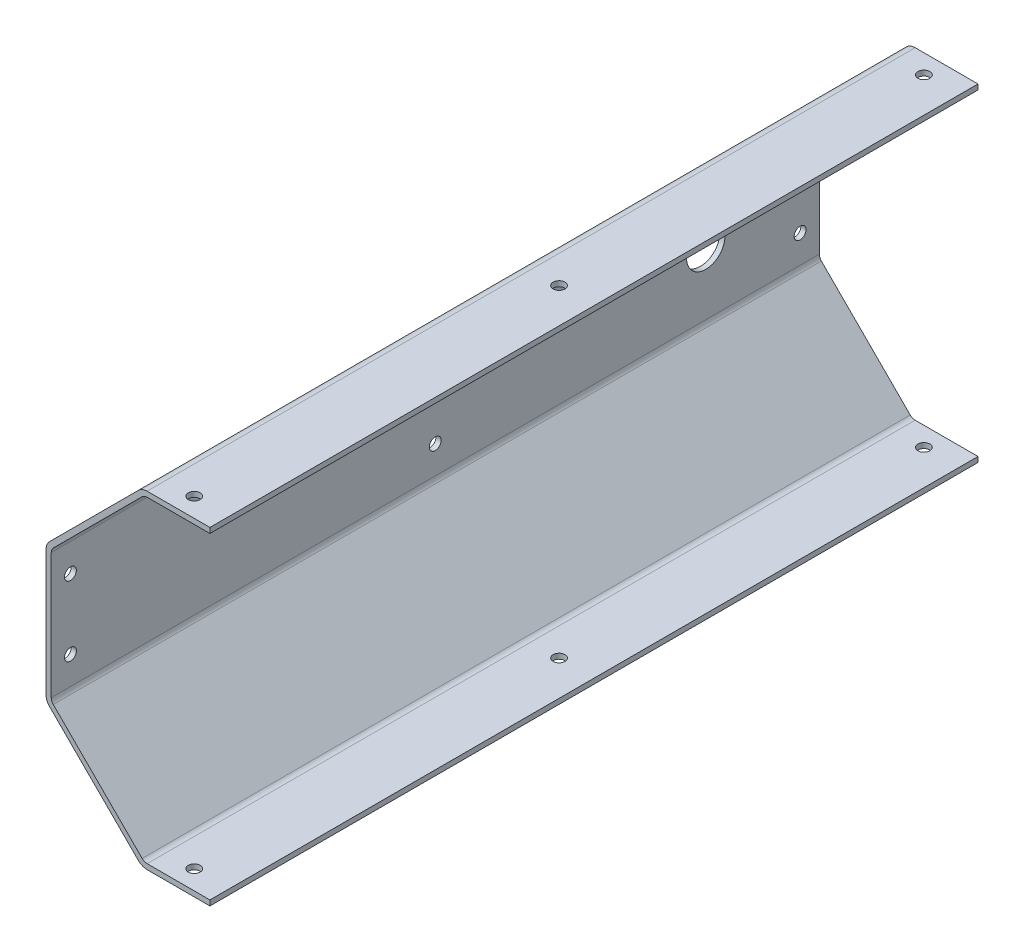
ISO-10303-21;
HEADER;
FILE_DESCRIPTION(('STEP AP214'),'2;1');
FILE_NAME('part.step','',(''),(''),'','','');
FILE_SCHEMA(('AUTOMOTIVE_DESIGN { 1 0 10303 214 1 1 1 1 }'));
ENDSEC;
DATA;
#1=APPLICATION_CONTEXT('core data for automotive mechanical design processes');
#2=APPLICATION_PROTOCOL_DEFINITION('international standard','automotive_design',2000,#1);
#3=PRODUCT_CONTEXT('',#1,'mechanical');
#4=PRODUCT('Part','Part','',(#3));
#5=PRODUCT_RELATED_PRODUCT_CATEGORY('part','',(#4));
#6=PRODUCT_DEFINITION_FORMATION('','',#4);
#7=PRODUCT_DEFINITION_CONTEXT('part definition',#1,'design');
#8=PRODUCT_DEFINITION('design','',#6,#7);
#9=PRODUCT_DEFINITION_SHAPE('','',#8);
#10=(LENGTH_UNIT() NAMED_UNIT(*) SI_UNIT(.MILLI.,.METRE.));
#11=(NAMED_UNIT(*) PLANE_ANGLE_UNIT() SI_UNIT($,.RADIAN.));
#12=(NAMED_UNIT(*) SI_UNIT($,.STERADIAN.) SOLID_ANGLE_UNIT());
#13=UNCERTAINTY_MEASURE_WITH_UNIT(LENGTH_MEASURE(1.E-05),#10,'distance_accuracy_value','');
#14=(GEOMETRIC_REPRESENTATION_CONTEXT(3) GLOBAL_UNCERTAINTY_ASSIGNED_CONTEXT((#13)) GLOBAL_UNIT_ASSIGNED_CONTEXT((#10,
#11,#12)) REPRESENTATION_CONTEXT('',''));
#15=CARTESIAN_POINT('',(0.,0.,0.));
#16=DIRECTION('',(0.,0.,1.));
#17=DIRECTION('',(1.,0.,0.));
#18=AXIS2_PLACEMENT_3D('',#15,#16,#17);
#19=CARTESIAN_POINT('',(-96.95,-17.9975792851109,-168.5));
#20=DIRECTION('',(1.,0.,0.));
#21=DIRECTION('',(0.,1.,0.));
#22=AXIS2_PLACEMENT_3D('',#19,#20,#21);
#23=PLANE('',#22);
#24=DIRECTION('',(0.,1.,0.));
#25=VECTOR('',#24,1.);
#26=CARTESIAN_POINT('',(-96.95,-17.9975792851109,51.5));
#27=LINE('',#26,#25);
#28=CARTESIAN_POINT('',(-96.95,-17.9975792851109,51.5));
#29=VERTEX_POINT('',#28);
#30=CARTESIAN_POINT('',(-96.95,17.9975792851113,51.5));
#31=VERTEX_POINT('',#30);
#32=EDGE_CURVE('E127',#29,#31,#27,.T.);
#33=ORIENTED_EDGE('',*,*,#32,.T.);
#34=DIRECTION('',(0.,0.,1.));
#35=VECTOR('',#34,1.);
#36=CARTESIAN_POINT('',(-96.95,17.9975792851113,-168.5));
#37=LINE('',#36,#35);
#38=CARTESIAN_POINT('',(-96.95,17.9975792851113,-168.5));
#39=VERTEX_POINT('',#38);
#40=EDGE_CURVE('E249',#39,#31,#37,.T.);
#41=ORIENTED_EDGE('',*,*,#40,.F.);
#42=DIRECTION('',(0.,1.,0.));
#43=VECTOR('',#42,1.);
#44=CARTESIAN_POINT('',(-96.95,-17.9975792851109,-168.5));
#45=LINE('',#44,#43);
#46=CARTESIAN_POINT('',(-96.95,-17.9975792851109,-168.5));
#47=VERTEX_POINT('',#46);
#48=EDGE_CURVE('E56',#47,#39,#45,.T.);
#49=ORIENTED_EDGE('',*,*,#48,.F.);
#50=DIRECTION('',(0.,0.,1.));
#51=VECTOR('',#50,1.);
#52=CARTESIAN_POINT('',(-96.95,-17.9975792851109,-168.5));
#53=LINE('',#52,#51);
#54=EDGE_CURVE('E200',#47,#29,#53,.T.);
#55=ORIENTED_EDGE('',*,*,#54,.T.);
#56=EDGE_LOOP('',(#33,#41,#49,#55));
#57=FACE_BOUND('',#56,.T.);
#58=CARTESIAN_POINT('',(-96.95,10.,-163.));
#59=DIRECTION('',(1.,0.,0.));
#60=DIRECTION('',(0.,1.,0.));
#61=AXIS2_PLACEMENT_3D('',#58,#59,#60);
#62=CIRCLE('',#61,1.7);
#63=CARTESIAN_POINT('',(-96.95,11.7,-163.));
#64=VERTEX_POINT('',#63);
#65=EDGE_CURVE('E868',#64,#64,#62,.T.);
#66=ORIENTED_EDGE('',*,*,#65,.T.);
#67=EDGE_LOOP('',(#66));
#68=FACE_BOUND('',#67,.T.);
#69=CARTESIAN_POINT('',(-96.95,-10.,-163.));
#70=DIRECTION('',(1.,0.,0.));
#71=DIRECTION('',(0.,1.,0.));
#72=AXIS2_PLACEMENT_3D('',#69,#70,#71);
#73=CIRCLE('',#72,1.7);
#74=CARTESIAN_POINT('',(-96.95,-8.3,-163.));
#75=VERTEX_POINT('',#74);
#76=EDGE_CURVE('E876',#75,#75,#73,.T.);
#77=ORIENTED_EDGE('',*,*,#76,.T.);
#78=EDGE_LOOP('',(#77));
#79=FACE_BOUND('',#78,.T.);
#80=CARTESIAN_POINT('',(-96.95,10.,-58.5));
#81=DIRECTION('',(1.,0.,0.));
#82=DIRECTION('',(0.,1.,0.));
#83=AXIS2_PLACEMENT_3D('',#80,#81,#82);
#84=CIRCLE('',#83,1.7);
#85=CARTESIAN_POINT('',(-96.95,11.7,-58.5));
#86=VERTEX_POINT('',#85);
#87=EDGE_CURVE('E882',#86,#86,#84,.T.);
#88=ORIENTED_EDGE('',*,*,#87,.T.);
#89=EDGE_LOOP('',(#88));
#90=FACE_BOUND('',#89,.T.);
#91=CARTESIAN_POINT('',(-96.95,-10.,-58.5));
#92=DIRECTION('',(1.,0.,0.));
#93=DIRECTION('',(0.,1.,0.));
#94=AXIS2_PLACEMENT_3D('',#91,#92,#93);
#95=CIRCLE('',#94,1.7);
#96=CARTESIAN_POINT('',(-96.95,-8.3,-58.5));
#97=VERTEX_POINT('',#96);
#98=EDGE_CURVE('E888',#97,#97,#95,.T.);
#99=ORIENTED_EDGE('',*,*,#98,.T.);
#100=EDGE_LOOP('',(#99));
#101=FACE_BOUND('',#100,.T.);
#102=CARTESIAN_POINT('',(-96.95,-10.,46.));
#103=DIRECTION('',(1.,0.,0.));
#104=DIRECTION('',(0.,1.,0.));
#105=AXIS2_PLACEMENT_3D('',#102,#103,#104);
#106=CIRCLE('',#105,1.7);
#107=CARTESIAN_POINT('',(-96.95,-8.3,46.));
#108=VERTEX_POINT('',#107);
#109=EDGE_CURVE('E894',#108,#108,#106,.T.);
#110=ORIENTED_EDGE('',*,*,#109,.T.);
#111=EDGE_LOOP('',(#110));
#112=FACE_BOUND('',#111,.T.);
#113=CARTESIAN_POINT('',(-96.95,10.,46.));
#114=DIRECTION('',(1.,0.,0.));
#115=DIRECTION('',(0.,1.,0.));
#116=AXIS2_PLACEMENT_3D('',#113,#114,#115);
#117=CIRCLE('',#116,1.7);
#118=CARTESIAN_POINT('',(-96.95,11.7,46.));
#119=VERTEX_POINT('',#118);
#120=EDGE_CURVE('E900',#119,#119,#117,.T.);
#121=ORIENTED_EDGE('',*,*,#120,.T.);
#122=EDGE_LOOP('',(#121));
#123=FACE_BOUND('',#122,.T.);
#124=CARTESIAN_POINT('',(-96.95,4.6743024256779E-05,-135.980047718646));
#125=DIRECTION('',(-1.,0.,0.));
#126=DIRECTION('',(0.,0.,1.));
#127=AXIS2_PLACEMENT_3D('',#124,#125,#126);
#128=CIRCLE('',#127,5.5);
#129=CARTESIAN_POINT('',(-96.95,4.67430242564422E-05,-130.480047718646));
#130=VERTEX_POINT('',#129);
#131=EDGE_CURVE('E903',#130,#130,#128,.T.);
#132=ORIENTED_EDGE('',*,*,#131,.F.);
#133=EDGE_LOOP('',(#132));
#134=FACE_BOUND('',#133,.T.);
#135=ADVANCED_FACE('F37',(#57,#68,#79,#90,#101,#112,#123,#134),#23,.F.);
#136=CARTESIAN_POINT('',(-50.,45.45,-168.5));
#137=DIRECTION('',(0.,1.,0.));
#138=DIRECTION('',(-1.,0.,0.));
#139=AXIS2_PLACEMENT_3D('',#136,#137,#138);
#140=PLANE('',#139);
#141=DIRECTION('',(-1.,0.,0.));
#142=VECTOR('',#141,1.);
#143=CARTESIAN_POINT('',(-50.,45.45,51.5));
#144=LINE('',#143,#142);
#145=CARTESIAN_POINT('',(-50.,45.45,51.5));
#146=VERTEX_POINT('',#145);
#147=CARTESIAN_POINT('',(-67.9975792851107,45.45,51.5));
#148=VERTEX_POINT('',#147);
#149=EDGE_CURVE('E219',#146,#148,#144,.T.);
#150=ORIENTED_EDGE('',*,*,#149,.T.);
#151=DIRECTION('',(0.,0.,1.));
#152=VECTOR('',#151,1.);
#153=CARTESIAN_POINT('',(-67.9975792851107,45.45,-168.5));
#154=LINE('',#153,#152);
#155=CARTESIAN_POINT('',(-67.9975792851107,45.45,-168.5));
#156=VERTEX_POINT('',#155);
#157=EDGE_CURVE('E283',#156,#148,#154,.T.);
#158=ORIENTED_EDGE('',*,*,#157,.F.);
#159=DIRECTION('',(-1.,0.,0.));
#160=VECTOR('',#159,1.);
#161=CARTESIAN_POINT('',(-50.,45.45,-168.5));
#162=LINE('',#161,#160);
#163=CARTESIAN_POINT('',(-50.,45.45,-168.5));
#164=VERTEX_POINT('',#163);
#165=EDGE_CURVE('E318',#164,#156,#162,.T.);
#166=ORIENTED_EDGE('',*,*,#165,.F.);
#167=DIRECTION('',(0.,0.,1.));
#168=VECTOR('',#167,1.);
#169=CARTESIAN_POINT('',(-50.,45.45,-168.5));
#170=LINE('',#169,#168);
#171=EDGE_CURVE('E286',#164,#146,#170,.T.);
#172=ORIENTED_EDGE('',*,*,#171,.T.);
#173=EDGE_LOOP('',(#150,#158,#166,#172));
#174=FACE_BOUND('',#173,.T.);
#175=CARTESIAN_POINT('',(-59.9999999999969,45.45,-163.));
#176=DIRECTION('',(0.,1.,0.));
#177=DIRECTION('',(0.,0.,-1.));
#178=AXIS2_PLACEMENT_3D('',#175,#176,#177);
#179=CIRCLE('',#178,1.7);
#180=CARTESIAN_POINT('',(-59.9999999999969,45.45,-164.7));
#181=VERTEX_POINT('',#180);
#182=EDGE_CURVE('E424',#181,#181,#179,.T.);
#183=ORIENTED_EDGE('',*,*,#182,.T.);
#184=EDGE_LOOP('',(#183));
#185=FACE_BOUND('',#184,.T.);
#186=CARTESIAN_POINT('',(-59.9999999999969,45.45,-58.5));
#187=DIRECTION('',(0.,1.,0.));
#188=DIRECTION('',(0.,0.,-1.));
#189=AXIS2_PLACEMENT_3D('',#186,#187,#188);
#190=CIRCLE('',#189,1.7);
#191=CARTESIAN_POINT('',(-59.9999999999969,45.45,-60.2));
#192=VERTEX_POINT('',#191);
#193=EDGE_CURVE('E413',#192,#192,#190,.T.);
#194=ORIENTED_EDGE('',*,*,#193,.T.);
#195=EDGE_LOOP('',(#194));
#196=FACE_BOUND('',#195,.T.);
#197=CARTESIAN_POINT('',(-59.9999999999969,45.45,46.));
#198=DIRECTION('',(0.,-1.,0.));
#199=DIRECTION('',(0.,0.,-1.));
#200=AXIS2_PLACEMENT_3D('',#197,#198,#199);
#201=CIRCLE('',#200,1.7);
#202=CARTESIAN_POINT('',(-59.9999999999969,45.45,44.3));
#203=VERTEX_POINT('',#202);
#204=EDGE_CURVE('E414',#203,#203,#201,.T.);
#205=ORIENTED_EDGE('',*,*,#204,.F.);
#206=EDGE_LOOP('',(#205));
#207=FACE_BOUND('',#206,.T.);
#208=ADVANCED_FACE('F395',(#174,#185,#196,#207),#140,.F.);
#209=CARTESIAN_POINT('',(-67.9975792851107,46.95,-168.5));
#210=DIRECTION('',(0.,-1.,0.));
#211=DIRECTION('',(1.,0.,0.));
#212=AXIS2_PLACEMENT_3D('',#209,#210,#211);
#213=PLANE('',#212);
#214=CARTESIAN_POINT('',(-59.9999999999969,46.95,46.));
#215=DIRECTION('',(0.,-1.,0.));
#216=DIRECTION('',(0.,0.,-1.));
#217=AXIS2_PLACEMENT_3D('',#214,#215,#216);
#218=CIRCLE('',#217,1.7);
#219=CARTESIAN_POINT('',(-59.9999999999969,46.95,44.3));
#220=VERTEX_POINT('',#219);
#221=EDGE_CURVE('E420',#220,#220,#218,.T.);
#222=ORIENTED_EDGE('',*,*,#221,.T.);
#223=EDGE_LOOP('',(#222));
#224=FACE_BOUND('',#223,.T.);
#225=CARTESIAN_POINT('',(-59.9999999999969,46.95,-163.));
#226=DIRECTION('',(0.,1.,0.));
#227=DIRECTION('',(0.,0.,-1.));
#228=AXIS2_PLACEMENT_3D('',#225,#226,#227);
#229=CIRCLE('',#228,1.7);
#230=CARTESIAN_POINT('',(-59.9999999999969,46.95,-164.7));
#231=VERTEX_POINT('',#230);
#232=EDGE_CURVE('E417',#231,#231,#229,.T.);
#233=ORIENTED_EDGE('',*,*,#232,.F.);
#234=EDGE_LOOP('',(#233));
#235=FACE_BOUND('',#234,.T.);
#236=DIRECTION('',(1.,0.,0.));
#237=VECTOR('',#236,1.);
#238=CARTESIAN_POINT('',(-67.9975792851107,46.95,51.5));
#239=LINE('',#238,#237);
#240=CARTESIAN_POINT('',(-67.9975792851107,46.95,51.5));
#241=VERTEX_POINT('',#240);
#242=CARTESIAN_POINT('',(-50.,46.95,51.5));
#243=VERTEX_POINT('',#242);
#244=EDGE_CURVE('E215',#241,#243,#239,.T.);
#245=ORIENTED_EDGE('',*,*,#244,.T.);
#246=DIRECTION('',(0.,0.,1.));
#247=VECTOR('',#246,1.);
#248=CARTESIAN_POINT('',(-50.,46.95,-168.5));
#249=LINE('',#248,#247);
#250=CARTESIAN_POINT('',(-50.,46.95,-168.5));
#251=VERTEX_POINT('',#250);
#252=EDGE_CURVE('E289',#251,#243,#249,.T.);
#253=ORIENTED_EDGE('',*,*,#252,.F.);
#254=DIRECTION('',(1.,0.,0.));
#255=VECTOR('',#254,1.);
#256=CARTESIAN_POINT('',(-67.9975792851107,46.95,-168.5));
#257=LINE('',#256,#255);
#258=CARTESIAN_POINT('',(-67.9975792851107,46.95,-168.5));
#259=VERTEX_POINT('',#258);
#260=EDGE_CURVE('E309',#259,#251,#257,.T.);
#261=ORIENTED_EDGE('',*,*,#260,.F.);
#262=DIRECTION('',(0.,0.,1.));
#263=VECTOR('',#262,1.);
#264=CARTESIAN_POINT('',(-67.9975792851107,46.95,-168.5));
#265=LINE('',#264,#263);
#266=EDGE_CURVE('E47',#259,#241,#265,.T.);
#267=ORIENTED_EDGE('',*,*,#266,.T.);
#268=EDGE_LOOP('',(#245,#253,#261,#267));
#269=FACE_BOUND('',#268,.T.);
#270=CARTESIAN_POINT('',(-59.9999999999969,46.95,-58.5));
#271=DIRECTION('',(0.,1.,0.));
#272=DIRECTION('',(0.,0.,-1.));
#273=AXIS2_PLACEMENT_3D('',#270,#271,#272);
#274=CIRCLE('',#273,1.7);
#275=CARTESIAN_POINT('',(-59.9999999999969,46.95,-60.2));
#276=VERTEX_POINT('',#275);
#277=EDGE_CURVE('E411',#276,#276,#274,.T.);
#278=ORIENTED_EDGE('',*,*,#277,.F.);
#279=EDGE_LOOP('',(#278));
#280=FACE_BOUND('',#279,.T.);
#281=ADVANCED_FACE('F404',(#224,#235,#269,#280),#213,.F.);
#282=CARTESIAN_POINT('',(-95.9248737341529,20.4724530192641,-168.5));
#283=DIRECTION('',(0.707106781186543,-0.707106781186553,0.));
#284=DIRECTION('',(0.707106781186553,0.707106781186543,0.));
#285=AXIS2_PLACEMENT_3D('',#282,#283,#284);
#286=PLANE('',#285);
#287=DIRECTION('',(0.707106781186553,0.707106781186543,0.));
#288=VECTOR('',#287,1.);
#289=CARTESIAN_POINT('',(-95.9248737341529,20.4724530192641,51.5));
#290=LINE('',#289,#288);
#291=CARTESIAN_POINT('',(-95.9248737341529,20.4724530192641,51.5));
#292=VERTEX_POINT('',#291);
#293=CARTESIAN_POINT('',(-70.4724530192636,45.9248737341531,51.5));
#294=VERTEX_POINT('',#293);
#295=EDGE_CURVE('E209',#292,#294,#290,.T.);
#296=ORIENTED_EDGE('',*,*,#295,.T.);
#297=DIRECTION('',(0.,0.,1.));
#298=VECTOR('',#297,1.);
#299=CARTESIAN_POINT('',(-70.4724530192636,45.9248737341531,-168.5));
#300=LINE('',#299,#298);
#301=CARTESIAN_POINT('',(-70.4724530192636,45.9248737341531,-168.5));
#302=VERTEX_POINT('',#301);
#303=EDGE_CURVE('E11',#302,#294,#300,.T.);
#304=ORIENTED_EDGE('',*,*,#303,.F.);
#305=DIRECTION('',(0.707106781186553,0.707106781186543,0.));
#306=VECTOR('',#305,1.);
#307=CARTESIAN_POINT('',(-95.9248737341529,20.4724530192641,-168.5));
#308=LINE('',#307,#306);
#309=CARTESIAN_POINT('',(-95.9248737341529,20.4724530192641,-168.5));
#310=VERTEX_POINT('',#309);
#311=EDGE_CURVE('E248',#310,#302,#308,.T.);
#312=ORIENTED_EDGE('',*,*,#311,.F.);
#313=DIRECTION('',(0.,0.,1.));
#314=VECTOR('',#313,1.);
#315=CARTESIAN_POINT('',(-95.9248737341529,20.4724530192641,-168.5));
#316=LINE('',#315,#314);
#317=EDGE_CURVE('E208',#310,#292,#316,.T.);
#318=ORIENTED_EDGE('',*,*,#317,.T.);
#319=EDGE_LOOP('',(#296,#304,#312,#318));
#320=FACE_BOUND('',#319,.T.);
#321=ADVANCED_FACE('F39',(#320),#286,.F.);
#322=CARTESIAN_POINT('',(-67.9975792851107,43.45,-168.5));
#323=DIRECTION('',(0.,0.,1.));
#324=DIRECTION('',(1.,0.,0.));
#325=AXIS2_PLACEMENT_3D('',#322,#323,#324);
#326=CYLINDRICAL_SURFACE('',#325,3.5);
#327=CARTESIAN_POINT('',(-67.9975792851107,43.45,51.5));
#328=DIRECTION('',(0.,0.,-1.));
#329=DIRECTION('',(1.,0.,0.));
#330=AXIS2_PLACEMENT_3D('',#327,#328,#329);
#331=CIRCLE('',#330,3.5);
#332=EDGE_CURVE('E212',#294,#241,#331,.T.);
#333=ORIENTED_EDGE('',*,*,#332,.T.);
#334=ORIENTED_EDGE('',*,*,#266,.F.);
#335=CARTESIAN_POINT('',(-67.9975792851107,43.45,-168.5));
#336=DIRECTION('',(0.,0.,-1.));
#337=DIRECTION('',(1.,0.,0.));
#338=AXIS2_PLACEMENT_3D('',#335,#336,#337);
#339=CIRCLE('',#338,3.5);
#340=EDGE_CURVE('E307',#302,#259,#339,.T.);
#341=ORIENTED_EDGE('',*,*,#340,.F.);
#342=ORIENTED_EDGE('',*,*,#303,.T.);
#343=EDGE_LOOP('',(#333,#334,#341,#342));
#344=FACE_BOUND('',#343,.T.);
#345=ADVANCED_FACE('F306',(#344),#326,.T.);
#346=CARTESIAN_POINT('',(-50.,46.95,-168.5));
#347=DIRECTION('',(-1.,0.,0.));
#348=DIRECTION('',(0.,0.,1.));
#349=AXIS2_PLACEMENT_3D('',#346,#347,#348);
#350=PLANE('',#349);
#351=DIRECTION('',(0.,-1.,0.));
#352=VECTOR('',#351,1.);
#353=CARTESIAN_POINT('',(-50.,46.95,51.5));
#354=LINE('',#353,#352);
#355=EDGE_CURVE('E217',#243,#146,#354,.T.);
#356=ORIENTED_EDGE('',*,*,#355,.T.);
#357=ORIENTED_EDGE('',*,*,#171,.F.);
#358=DIRECTION('',(0.,-1.,0.));
#359=VECTOR('',#358,1.);
#360=CARTESIAN_POINT('',(-50.,46.95,-168.5));
#361=LINE('',#360,#359);
#362=EDGE_CURVE('E316',#251,#164,#361,.T.);
#363=ORIENTED_EDGE('',*,*,#362,.F.);
#364=ORIENTED_EDGE('',*,*,#252,.T.);
#365=EDGE_LOOP('',(#356,#357,#363,#364));
#366=FACE_BOUND('',#365,.T.);
#367=ADVANCED_FACE('F401',(#366),#350,.F.);
#368=CARTESIAN_POINT('',(-67.9975792851107,43.45,-168.5));
#369=DIRECTION('',(0.,0.,1.));
#370=DIRECTION('',(1.,0.,0.));
#371=AXIS2_PLACEMENT_3D('',#368,#369,#370);
#372=CYLINDRICAL_SURFACE('',#371,2.);
#373=CARTESIAN_POINT('',(-67.9975792851107,43.45,51.5));
#374=DIRECTION('',(0.,0.,1.));
#375=DIRECTION('',(1.,0.,0.));
#376=AXIS2_PLACEMENT_3D('',#373,#374,#375);
#377=CIRCLE('',#376,2.);
#378=CARTESIAN_POINT('',(-69.4117928474838,44.8642135623733,51.5));
#379=VERTEX_POINT('',#378);
#380=EDGE_CURVE('E221',#148,#379,#377,.T.);
#381=ORIENTED_EDGE('',*,*,#380,.T.);
#382=DIRECTION('',(0.,0.,1.));
#383=VECTOR('',#382,1.);
#384=CARTESIAN_POINT('',(-69.4117928474838,44.8642135623733,-168.5));
#385=LINE('',#384,#383);
#386=CARTESIAN_POINT('',(-69.4117928474838,44.8642135623733,-168.5));
#387=VERTEX_POINT('',#386);
#388=EDGE_CURVE('E280',#387,#379,#385,.T.);
#389=ORIENTED_EDGE('',*,*,#388,.F.);
#390=CARTESIAN_POINT('',(-67.9975792851107,43.45,-168.5));
#391=DIRECTION('',(0.,0.,1.));
#392=DIRECTION('',(1.,0.,0.));
#393=AXIS2_PLACEMENT_3D('',#390,#391,#392);
#394=CIRCLE('',#393,2.);
#395=EDGE_CURVE('E320',#156,#387,#394,.T.);
#396=ORIENTED_EDGE('',*,*,#395,.F.);
#397=ORIENTED_EDGE('',*,*,#157,.T.);
#398=EDGE_LOOP('',(#381,#389,#396,#397));
#399=FACE_BOUND('',#398,.T.);
#400=ADVANCED_FACE('F391',(#399),#372,.F.);
#401=CARTESIAN_POINT('',(-69.4117928474838,44.8642135623733,-168.5));
#402=DIRECTION('',(-0.707106781186543,0.707106781186553,0.));
#403=DIRECTION('',(-0.707106781186553,-0.707106781186543,0.));
#404=AXIS2_PLACEMENT_3D('',#401,#402,#403);
#405=PLANE('',#404);
#406=DIRECTION('',(-0.707106781186553,-0.707106781186543,0.));
#407=VECTOR('',#406,1.);
#408=CARTESIAN_POINT('',(-69.4117928474838,44.8642135623733,51.5));
#409=LINE('',#408,#407);
#410=CARTESIAN_POINT('',(-94.864213562373,19.4117928474843,51.5));
#411=VERTEX_POINT('',#410);
#412=EDGE_CURVE('E223',#379,#411,#409,.T.);
#413=ORIENTED_EDGE('',*,*,#412,.T.);
#414=DIRECTION('',(0.,0.,1.));
#415=VECTOR('',#414,1.);
#416=CARTESIAN_POINT('',(-94.864213562373,19.4117928474843,-168.5));
#417=LINE('',#416,#415);
#418=CARTESIAN_POINT('',(-94.864213562373,19.4117928474843,-168.5));
#419=VERTEX_POINT('',#418);
#420=EDGE_CURVE('E277',#419,#411,#417,.T.);
#421=ORIENTED_EDGE('',*,*,#420,.F.);
#422=DIRECTION('',(-0.707106781186553,-0.707106781186543,0.));
#423=VECTOR('',#422,1.);
#424=CARTESIAN_POINT('',(-69.4117928474838,44.8642135623733,-168.5));
#425=LINE('',#424,#423);
#426=EDGE_CURVE('E322',#387,#419,#425,.T.);
#427=ORIENTED_EDGE('',*,*,#426,.F.);
#428=ORIENTED_EDGE('',*,*,#388,.T.);
#429=EDGE_LOOP('',(#413,#421,#427,#428));
#430=FACE_BOUND('',#429,.T.);
#431=ADVANCED_FACE('F387',(#430),#405,.F.);
#432=CARTESIAN_POINT('',(-93.45,17.9975792851112,-168.5));
#433=DIRECTION('',(0.,0.,1.));
#434=DIRECTION('',(1.,0.,0.));
#435=AXIS2_PLACEMENT_3D('',#432,#433,#434);
#436=CYLINDRICAL_SURFACE('',#435,2.);
#437=CARTESIAN_POINT('',(-93.45,17.9975792851112,51.5));
#438=DIRECTION('',(0.,0.,1.));
#439=DIRECTION('',(1.,0.,0.));
#440=AXIS2_PLACEMENT_3D('',#437,#438,#439);
#441=CIRCLE('',#440,2.);
#442=CARTESIAN_POINT('',(-95.45,17.9975792851113,51.5));
#443=VERTEX_POINT('',#442);
#444=EDGE_CURVE('E225',#411,#443,#441,.T.);
#445=ORIENTED_EDGE('',*,*,#444,.T.);
#446=DIRECTION('',(0.,0.,1.));
#447=VECTOR('',#446,1.);
#448=CARTESIAN_POINT('',(-95.45,17.9975792851113,-168.5));
#449=LINE('',#448,#447);
#450=CARTESIAN_POINT('',(-95.45,17.9975792851113,-168.5));
#451=VERTEX_POINT('',#450);
#452=EDGE_CURVE('E274',#451,#443,#449,.T.);
#453=ORIENTED_EDGE('',*,*,#452,.F.);
#454=CARTESIAN_POINT('',(-93.45,17.9975792851112,-168.5));
#455=DIRECTION('',(0.,0.,1.));
#456=DIRECTION('',(1.,0.,0.));
#457=AXIS2_PLACEMENT_3D('',#454,#455,#456);
#458=CIRCLE('',#457,2.);
#459=EDGE_CURVE('E324',#419,#451,#458,.T.);
#460=ORIENTED_EDGE('',*,*,#459,.F.);
#461=ORIENTED_EDGE('',*,*,#420,.T.);
#462=EDGE_LOOP('',(#445,#453,#460,#461));
#463=FACE_BOUND('',#462,.T.);
#464=ADVANCED_FACE('F382',(#463),#436,.F.);
#465=CARTESIAN_POINT('',(-95.45,17.9975792851112,-168.5));
#466=DIRECTION('',(-1.,0.,0.));
#467=DIRECTION('',(0.,-1.,0.));
#468=AXIS2_PLACEMENT_3D('',#465,#466,#467);
#469=PLANE('',#468);
#470=CARTESIAN_POINT('',(-95.45,4.67430242533091E-05,-135.980047718646));
#471=DIRECTION('',(-1.,0.,0.));
#472=DIRECTION('',(0.,-1.,0.));
#473=AXIS2_PLACEMENT_3D('',#470,#471,#472);
#474=CIRCLE('',#473,5.5);
#475=CARTESIAN_POINT('',(-95.45,-5.49995325697575,-135.980047718646));
#476=VERTEX_POINT('',#475);
#477=EDGE_CURVE('E41',#476,#476,#474,.T.);
#478=ORIENTED_EDGE('',*,*,#477,.T.);
#479=EDGE_LOOP('',(#478));
#480=FACE_BOUND('',#479,.T.);
#481=CARTESIAN_POINT('',(-95.45,10.,46.));
#482=DIRECTION('',(-1.,0.,0.));
#483=DIRECTION('',(0.,-1.,0.));
#484=AXIS2_PLACEMENT_3D('',#481,#482,#483);
#485=CIRCLE('',#484,1.7);
#486=CARTESIAN_POINT('',(-95.45,8.3,46.));
#487=VERTEX_POINT('',#486);
#488=EDGE_CURVE('E897',#487,#487,#485,.T.);
#489=ORIENTED_EDGE('',*,*,#488,.T.);
#490=EDGE_LOOP('',(#489));
#491=FACE_BOUND('',#490,.T.);
#492=CARTESIAN_POINT('',(-95.45,-10.,46.));
#493=DIRECTION('',(-1.,0.,0.));
#494=DIRECTION('',(0.,-1.,0.));
#495=AXIS2_PLACEMENT_3D('',#492,#493,#494);
#496=CIRCLE('',#495,1.7);
#497=CARTESIAN_POINT('',(-95.45,-11.7,46.));
#498=VERTEX_POINT('',#497);
#499=EDGE_CURVE('E891',#498,#498,#496,.T.);
#500=ORIENTED_EDGE('',*,*,#499,.T.);
#501=EDGE_LOOP('',(#500));
#502=FACE_BOUND('',#501,.T.);
#503=CARTESIAN_POINT('',(-95.45,-10.,-58.5));
#504=DIRECTION('',(-1.,0.,0.));
#505=DIRECTION('',(0.,-1.,0.));
#506=AXIS2_PLACEMENT_3D('',#503,#504,#505);
#507=CIRCLE('',#506,1.7);
#508=CARTESIAN_POINT('',(-95.45,-11.7,-58.5));
#509=VERTEX_POINT('',#508);
#510=EDGE_CURVE('E885',#509,#509,#507,.T.);
#511=ORIENTED_EDGE('',*,*,#510,.T.);
#512=EDGE_LOOP('',(#511));
#513=FACE_BOUND('',#512,.T.);
#514=CARTESIAN_POINT('',(-95.45,10.,-58.5));
#515=DIRECTION('',(-1.,0.,0.));
#516=DIRECTION('',(0.,-1.,0.));
#517=AXIS2_PLACEMENT_3D('',#514,#515,#516);
#518=CIRCLE('',#517,1.7);
#519=CARTESIAN_POINT('',(-95.45,8.3,-58.5));
#520=VERTEX_POINT('',#519);
#521=EDGE_CURVE('E879',#520,#520,#518,.T.);
#522=ORIENTED_EDGE('',*,*,#521,.T.);
#523=EDGE_LOOP('',(#522));
#524=FACE_BOUND('',#523,.T.);
#525=CARTESIAN_POINT('',(-95.45,-10.,-163.));
#526=DIRECTION('',(-1.,0.,0.));
#527=DIRECTION('',(0.,-1.,0.));
#528=AXIS2_PLACEMENT_3D('',#525,#526,#527);
#529=CIRCLE('',#528,1.7);
#530=CARTESIAN_POINT('',(-95.45,-11.7,-163.));
#531=VERTEX_POINT('',#530);
#532=EDGE_CURVE('E873',#531,#531,#529,.T.);
#533=ORIENTED_EDGE('',*,*,#532,.T.);
#534=EDGE_LOOP('',(#533));
#535=FACE_BOUND('',#534,.T.);
#536=CARTESIAN_POINT('',(-95.45,10.,-163.));
#537=DIRECTION('',(-1.,0.,0.));
#538=DIRECTION('',(0.,-1.,0.));
#539=AXIS2_PLACEMENT_3D('',#536,#537,#538);
#540=CIRCLE('',#539,1.7);
#541=CARTESIAN_POINT('',(-95.45,8.3,-163.));
#542=VERTEX_POINT('',#541);
#543=EDGE_CURVE('E866',#542,#542,#540,.T.);
#544=ORIENTED_EDGE('',*,*,#543,.T.);
#545=EDGE_LOOP('',(#544));
#546=FACE_BOUND('',#545,.T.);
#547=DIRECTION('',(0.,-1.,0.));
#548=VECTOR('',#547,1.);
#549=CARTESIAN_POINT('',(-95.45,17.9975792851112,51.5));
#550=LINE('',#549,#548);
#551=CARTESIAN_POINT('',(-95.45,-17.9975792851109,51.5));
#552=VERTEX_POINT('',#551);
#553=EDGE_CURVE('E227',#443,#552,#550,.T.);
#554=ORIENTED_EDGE('',*,*,#553,.T.);
#555=DIRECTION('',(0.,0.,1.));
#556=VECTOR('',#555,1.);
#557=CARTESIAN_POINT('',(-95.45,-17.9975792851109,-168.5));
#558=LINE('',#557,#556);
#559=CARTESIAN_POINT('',(-95.45,-17.9975792851109,-168.5));
#560=VERTEX_POINT('',#559);
#561=EDGE_CURVE('E271',#560,#552,#558,.T.);
#562=ORIENTED_EDGE('',*,*,#561,.F.);
#563=DIRECTION('',(0.,-1.,0.));
#564=VECTOR('',#563,1.);
#565=CARTESIAN_POINT('',(-95.45,17.9975792851112,-168.5));
#566=LINE('',#565,#564);
#567=EDGE_CURVE('E326',#451,#560,#566,.T.);
#568=ORIENTED_EDGE('',*,*,#567,.F.);
#569=ORIENTED_EDGE('',*,*,#452,.T.);
#570=EDGE_LOOP('',(#554,#562,#568,#569));
#571=FACE_BOUND('',#570,.T.);
#572=ADVANCED_FACE('F376',(#480,#491,#502,#513,#524,#535,#546,#571),#469,.F.);
#573=CARTESIAN_POINT('',(-93.45,-17.9975792851109,-168.5));
#574=DIRECTION('',(0.,0.,1.));
#575=DIRECTION('',(1.,0.,0.));
#576=AXIS2_PLACEMENT_3D('',#573,#574,#575);
#577=CYLINDRICAL_SURFACE('',#576,2.);
#578=CARTESIAN_POINT('',(-93.45,-17.9975792851109,51.5));
#579=DIRECTION('',(0.,0.,1.));
#580=DIRECTION('',(1.,0.,0.));
#581=AXIS2_PLACEMENT_3D('',#578,#579,#580);
#582=CIRCLE('',#581,2.);
#583=CARTESIAN_POINT('',(-94.8642135623731,-19.411792847484,51.5));
#584=VERTEX_POINT('',#583);
#585=EDGE_CURVE('E229',#552,#584,#582,.T.);
#586=ORIENTED_EDGE('',*,*,#585,.T.);
#587=DIRECTION('',(0.,0.,1.));
#588=VECTOR('',#587,1.);
#589=CARTESIAN_POINT('',(-94.8642135623731,-19.411792847484,-168.5));
#590=LINE('',#589,#588);
#591=CARTESIAN_POINT('',(-94.8642135623731,-19.411792847484,-168.5));
#592=VERTEX_POINT('',#591);
#593=EDGE_CURVE('E268',#592,#584,#590,.T.);
#594=ORIENTED_EDGE('',*,*,#593,.F.);
#595=CARTESIAN_POINT('',(-93.45,-17.9975792851109,-168.5));
#596=DIRECTION('',(0.,0.,1.));
#597=DIRECTION('',(1.,0.,0.));
#598=AXIS2_PLACEMENT_3D('',#595,#596,#597);
#599=CIRCLE('',#598,2.);
#600=EDGE_CURVE('E328',#560,#592,#599,.T.);
#601=ORIENTED_EDGE('',*,*,#600,.F.);
#602=ORIENTED_EDGE('',*,*,#561,.T.);
#603=EDGE_LOOP('',(#586,#594,#601,#602));
#604=FACE_BOUND('',#603,.T.);
#605=ADVANCED_FACE('F372',(#604),#577,.F.);
#606=CARTESIAN_POINT('',(-94.8642135623732,-19.411792847484,-168.5));
#607=DIRECTION('',(-0.707106781186549,-0.707106781186546,0.));
#608=DIRECTION('',(0.707106781186546,-0.707106781186549,0.));
#609=AXIS2_PLACEMENT_3D('',#606,#607,#608);
#610=PLANE('',#609);
#611=DIRECTION('',(0.707106781186546,-0.707106781186549,0.));
#612=VECTOR('',#611,1.);
#613=CARTESIAN_POINT('',(-94.8642135623732,-19.411792847484,51.5));
#614=LINE('',#613,#612);
#615=CARTESIAN_POINT('',(-69.4117928474842,-44.8642135623731,51.5));
#616=VERTEX_POINT('',#615);
#617=EDGE_CURVE('E231',#584,#616,#614,.T.);
#618=ORIENTED_EDGE('',*,*,#617,.T.);
#619=DIRECTION('',(0.,0.,1.));
#620=VECTOR('',#619,1.);
#621=CARTESIAN_POINT('',(-69.4117928474842,-44.8642135623731,-168.5));
#622=LINE('',#621,#620);
#623=CARTESIAN_POINT('',(-69.4117928474842,-44.8642135623731,-168.5));
#624=VERTEX_POINT('',#623);
#625=EDGE_CURVE('E265',#624,#616,#622,.T.);
#626=ORIENTED_EDGE('',*,*,#625,.F.);
#627=DIRECTION('',(0.707106781186546,-0.707106781186549,0.));
#628=VECTOR('',#627,1.);
#629=CARTESIAN_POINT('',(-94.8642135623732,-19.411792847484,-168.5));
#630=LINE('',#629,#628);
#631=EDGE_CURVE('E330',#592,#624,#630,.T.);
#632=ORIENTED_EDGE('',*,*,#631,.F.);
#633=ORIENTED_EDGE('',*,*,#593,.T.);
#634=EDGE_LOOP('',(#618,#626,#632,#633));
#635=FACE_BOUND('',#634,.T.);
#636=ADVANCED_FACE('F367',(#635),#610,.F.);
#637=CARTESIAN_POINT('',(-67.9975792851111,-43.45,-168.5));
#638=DIRECTION('',(0.,0.,1.));
#639=DIRECTION('',(1.,0.,0.));
#640=AXIS2_PLACEMENT_3D('',#637,#638,#639);
#641=CYLINDRICAL_SURFACE('',#640,2.);
#642=CARTESIAN_POINT('',(-67.9975792851111,-43.45,51.5));
#643=DIRECTION('',(0.,0.,1.));
#644=DIRECTION('',(1.,0.,0.));
#645=AXIS2_PLACEMENT_3D('',#642,#643,#644);
#646=CIRCLE('',#645,2.);
#647=CARTESIAN_POINT('',(-67.9975792851112,-45.45,51.5));
#648=VERTEX_POINT('',#647);
#649=EDGE_CURVE('E233',#616,#648,#646,.T.);
#650=ORIENTED_EDGE('',*,*,#649,.T.);
#651=DIRECTION('',(0.,0.,1.));
#652=VECTOR('',#651,1.);
#653=CARTESIAN_POINT('',(-67.9975792851112,-45.45,-168.5));
#654=LINE('',#653,#652);
#655=CARTESIAN_POINT('',(-67.9975792851112,-45.45,-168.5));
#656=VERTEX_POINT('',#655);
#657=EDGE_CURVE('E262',#656,#648,#654,.T.);
#658=ORIENTED_EDGE('',*,*,#657,.F.);
#659=CARTESIAN_POINT('',(-67.9975792851111,-43.45,-168.5));
#660=DIRECTION('',(0.,0.,1.));
#661=DIRECTION('',(1.,0.,0.));
#662=AXIS2_PLACEMENT_3D('',#659,#660,#661);
#663=CIRCLE('',#662,2.);
#664=EDGE_CURVE('E332',#624,#656,#663,.T.);
#665=ORIENTED_EDGE('',*,*,#664,.F.);
#666=ORIENTED_EDGE('',*,*,#625,.T.);
#667=EDGE_LOOP('',(#650,#658,#665,#666));
#668=FACE_BOUND('',#667,.T.);
#669=ADVANCED_FACE('F361',(#668),#641,.F.);
#670=CARTESIAN_POINT('',(-67.9975792851112,-45.45,-168.5));
#671=DIRECTION('',(0.,-1.,0.));
#672=DIRECTION('',(1.,0.,0.));
#673=AXIS2_PLACEMENT_3D('',#670,#671,#672);
#674=PLANE('',#673);
#675=CARTESIAN_POINT('',(-60.,-45.45,46.));
#676=DIRECTION('',(0.,-1.,0.));
#677=DIRECTION('',(1.,0.,0.));
#678=AXIS2_PLACEMENT_3D('',#675,#676,#677);
#679=CIRCLE('',#678,1.7);
#680=CARTESIAN_POINT('',(-58.3,-45.45,46.));
#681=VERTEX_POINT('',#680);
#682=EDGE_CURVE('E432',#681,#681,#679,.T.);
#683=ORIENTED_EDGE('',*,*,#682,.T.);
#684=EDGE_LOOP('',(#683));
#685=FACE_BOUND('',#684,.T.);
#686=CARTESIAN_POINT('',(-60.,-45.45,-58.5));
#687=DIRECTION('',(0.,-1.,0.));
#688=DIRECTION('',(1.,0.,0.));
#689=AXIS2_PLACEMENT_3D('',#686,#687,#688);
#690=CIRCLE('',#689,1.7);
#691=CARTESIAN_POINT('',(-58.3,-45.45,-58.5));
#692=VERTEX_POINT('',#691);
#693=EDGE_CURVE('E438',#692,#692,#690,.T.);
#694=ORIENTED_EDGE('',*,*,#693,.T.);
#695=EDGE_LOOP('',(#694));
#696=FACE_BOUND('',#695,.T.);
#697=CARTESIAN_POINT('',(-60.,-45.45,-163.));
#698=DIRECTION('',(0.,-1.,0.));
#699=DIRECTION('',(1.,0.,0.));
#700=AXIS2_PLACEMENT_3D('',#697,#698,#699);
#701=CIRCLE('',#700,1.7);
#702=CARTESIAN_POINT('',(-58.3,-45.45,-163.));
#703=VERTEX_POINT('',#702);
#704=EDGE_CURVE('E213',#703,#703,#701,.T.);
#705=ORIENTED_EDGE('',*,*,#704,.T.);
#706=EDGE_LOOP('',(#705));
#707=FACE_BOUND('',#706,.T.);
#708=DIRECTION('',(1.,0.,0.));
#709=VECTOR('',#708,1.);
#710=CARTESIAN_POINT('',(-67.9975792851112,-45.45,51.5));
#711=LINE('',#710,#709);
#712=CARTESIAN_POINT('',(-50.,-45.45,51.5));
#713=VERTEX_POINT('',#712);
#714=EDGE_CURVE('E235',#648,#713,#711,.T.);
#715=ORIENTED_EDGE('',*,*,#714,.T.);
#716=DIRECTION('',(0.,0.,1.));
#717=VECTOR('',#716,1.);
#718=CARTESIAN_POINT('',(-50.,-45.45,-168.5));
#719=LINE('',#718,#717);
#720=CARTESIAN_POINT('',(-50.,-45.45,-168.5));
#721=VERTEX_POINT('',#720);
#722=EDGE_CURVE('E259',#721,#713,#719,.T.);
#723=ORIENTED_EDGE('',*,*,#722,.F.);
#724=DIRECTION('',(1.,0.,0.));
#725=VECTOR('',#724,1.);
#726=CARTESIAN_POINT('',(-67.9975792851112,-45.45,-168.5));
#727=LINE('',#726,#725);
#728=EDGE_CURVE('E334',#656,#721,#727,.T.);
#729=ORIENTED_EDGE('',*,*,#728,.F.);
#730=ORIENTED_EDGE('',*,*,#657,.T.);
#731=EDGE_LOOP('',(#715,#723,#729,#730));
#732=FACE_BOUND('',#731,.T.);
#733=ADVANCED_FACE('F357',(#685,#696,#707,#732),#674,.F.);
#734=CARTESIAN_POINT('',(-50.,-45.45,-168.5));
#735=DIRECTION('',(-1.,0.,0.));
#736=DIRECTION('',(0.,0.,1.));
#737=AXIS2_PLACEMENT_3D('',#734,#735,#736);
#738=PLANE('',#737);
#739=DIRECTION('',(0.,-1.,0.));
#740=VECTOR('',#739,1.);
#741=CARTESIAN_POINT('',(-50.,-45.45,51.5));
#742=LINE('',#741,#740);
#743=CARTESIAN_POINT('',(-50.,-46.95,51.5));
#744=VERTEX_POINT('',#743);
#745=EDGE_CURVE('E237',#713,#744,#742,.T.);
#746=ORIENTED_EDGE('',*,*,#745,.T.);
#747=DIRECTION('',(0.,0.,1.));
#748=VECTOR('',#747,1.);
#749=CARTESIAN_POINT('',(-50.,-46.95,-168.5));
#750=LINE('',#749,#748);
#751=CARTESIAN_POINT('',(-50.,-46.95,-168.5));
#752=VERTEX_POINT('',#751);
#753=EDGE_CURVE('E256',#752,#744,#750,.T.);
#754=ORIENTED_EDGE('',*,*,#753,.F.);
#755=DIRECTION('',(0.,-1.,0.));
#756=VECTOR('',#755,1.);
#757=CARTESIAN_POINT('',(-50.,-45.45,-168.5));
#758=LINE('',#757,#756);
#759=EDGE_CURVE('E336',#721,#752,#758,.T.);
#760=ORIENTED_EDGE('',*,*,#759,.F.);
#761=ORIENTED_EDGE('',*,*,#722,.T.);
#762=EDGE_LOOP('',(#746,#754,#760,#761));
#763=FACE_BOUND('',#762,.T.);
#764=ADVANCED_FACE('F353',(#763),#738,.F.);
#765=CARTESIAN_POINT('',(-50.,-46.95,-168.5));
#766=DIRECTION('',(0.,1.,0.));
#767=DIRECTION('',(0.,0.,1.));
#768=AXIS2_PLACEMENT_3D('',#765,#766,#767);
#769=PLANE('',#768);
#770=CARTESIAN_POINT('',(-60.,-46.95,46.));
#771=DIRECTION('',(0.,1.,0.));
#772=DIRECTION('',(0.,0.,1.));
#773=AXIS2_PLACEMENT_3D('',#770,#771,#772);
#774=CIRCLE('',#773,1.7);
#775=CARTESIAN_POINT('',(-60.,-46.95,47.7));
#776=VERTEX_POINT('',#775);
#777=EDGE_CURVE('E427',#776,#776,#774,.T.);
#778=ORIENTED_EDGE('',*,*,#777,.T.);
#779=EDGE_LOOP('',(#778));
#780=FACE_BOUND('',#779,.T.);
#781=CARTESIAN_POINT('',(-60.,-46.95,-58.5));
#782=DIRECTION('',(0.,1.,0.));
#783=DIRECTION('',(0.,0.,1.));
#784=AXIS2_PLACEMENT_3D('',#781,#782,#783);
#785=CIRCLE('',#784,1.7);
#786=CARTESIAN_POINT('',(-60.,-46.95,-56.8));
#787=VERTEX_POINT('',#786);
#788=EDGE_CURVE('E435',#787,#787,#785,.T.);
#789=ORIENTED_EDGE('',*,*,#788,.T.);
#790=EDGE_LOOP('',(#789));
#791=FACE_BOUND('',#790,.T.);
#792=CARTESIAN_POINT('',(-60.,-46.95,-163.));
#793=DIRECTION('',(0.,1.,0.));
#794=DIRECTION('',(0.,0.,1.));
#795=AXIS2_PLACEMENT_3D('',#792,#793,#794);
#796=CIRCLE('',#795,1.7);
#797=CARTESIAN_POINT('',(-60.,-46.95,-161.3));
#798=VERTEX_POINT('',#797);
#799=EDGE_CURVE('E440',#798,#798,#796,.T.);
#800=ORIENTED_EDGE('',*,*,#799,.T.);
#801=EDGE_LOOP('',(#800));
#802=FACE_BOUND('',#801,.T.);
#803=DIRECTION('',(-1.,0.,0.));
#804=VECTOR('',#803,1.);
#805=CARTESIAN_POINT('',(-50.,-46.95,51.5));
#806=LINE('',#805,#804);
#807=CARTESIAN_POINT('',(-67.9975792851112,-46.95,51.5));
#808=VERTEX_POINT('',#807);
#809=EDGE_CURVE('E239',#744,#808,#806,.T.);
#810=ORIENTED_EDGE('',*,*,#809,.T.);
#811=DIRECTION('',(0.,0.,1.));
#812=VECTOR('',#811,1.);
#813=CARTESIAN_POINT('',(-67.9975792851112,-46.95,-168.5));
#814=LINE('',#813,#812);
#815=CARTESIAN_POINT('',(-67.9975792851112,-46.95,-168.5));
#816=VERTEX_POINT('',#815);
#817=EDGE_CURVE('E253',#816,#808,#814,.T.);
#818=ORIENTED_EDGE('',*,*,#817,.F.);
#819=DIRECTION('',(-1.,0.,0.));
#820=VECTOR('',#819,1.);
#821=CARTESIAN_POINT('',(-50.,-46.95,-168.5));
#822=LINE('',#821,#820);
#823=EDGE_CURVE('E338',#752,#816,#822,.T.);
#824=ORIENTED_EDGE('',*,*,#823,.F.);
#825=ORIENTED_EDGE('',*,*,#753,.T.);
#826=EDGE_LOOP('',(#810,#818,#824,#825));
#827=FACE_BOUND('',#826,.T.);
#828=ADVANCED_FACE('F344',(#780,#791,#802,#827),#769,.F.);
#829=CARTESIAN_POINT('',(-67.9975792851111,-43.45,-168.5));
#830=DIRECTION('',(0.,0.,1.));
#831=DIRECTION('',(1.,0.,0.));
#832=AXIS2_PLACEMENT_3D('',#829,#830,#831);
#833=CYLINDRICAL_SURFACE('',#832,3.5);
#834=CARTESIAN_POINT('',(-67.9975792851111,-43.45,51.5));
#835=DIRECTION('',(0.,0.,-1.));
#836=DIRECTION('',(1.,0.,0.));
#837=AXIS2_PLACEMENT_3D('',#834,#835,#836);
#838=CIRCLE('',#837,3.5);
#839=CARTESIAN_POINT('',(-70.472453019264,-45.9248737341529,51.5));
#840=VERTEX_POINT('',#839);
#841=EDGE_CURVE('E241',#808,#840,#838,.T.);
#842=ORIENTED_EDGE('',*,*,#841,.T.);
#843=DIRECTION('',(0.,0.,1.));
#844=VECTOR('',#843,1.);
#845=CARTESIAN_POINT('',(-70.472453019264,-45.9248737341529,-168.5));
#846=LINE('',#845,#844);
#847=CARTESIAN_POINT('',(-70.472453019264,-45.9248737341529,-168.5));
#848=VERTEX_POINT('',#847);
#849=EDGE_CURVE('E199',#848,#840,#846,.T.);
#850=ORIENTED_EDGE('',*,*,#849,.F.);
#851=CARTESIAN_POINT('',(-67.9975792851111,-43.45,-168.5));
#852=DIRECTION('',(0.,0.,-1.));
#853=DIRECTION('',(1.,0.,0.));
#854=AXIS2_PLACEMENT_3D('',#851,#852,#853);
#855=CIRCLE('',#854,3.5);
#856=EDGE_CURVE('E190',#816,#848,#855,.T.);
#857=ORIENTED_EDGE('',*,*,#856,.F.);
#858=ORIENTED_EDGE('',*,*,#817,.T.);
#859=EDGE_LOOP('',(#842,#850,#857,#858));
#860=FACE_BOUND('',#859,.T.);
#861=ADVANCED_FACE('F348',(#860),#833,.T.);
#862=CARTESIAN_POINT('',(-93.45,-17.9975792851109,-168.5));
#863=DIRECTION('',(0.,0.,1.));
#864=DIRECTION('',(1.,0.,0.));
#865=AXIS2_PLACEMENT_3D('',#862,#863,#864);
#866=CYLINDRICAL_SURFACE('',#865,3.5);
#867=CARTESIAN_POINT('',(-93.45,-17.9975792851109,51.5));
#868=DIRECTION('',(0.,0.,-1.));
#869=DIRECTION('',(1.,0.,0.));
#870=AXIS2_PLACEMENT_3D('',#867,#868,#869);
#871=CIRCLE('',#870,3.5);
#872=CARTESIAN_POINT('',(-95.924873734153,-20.4724530192638,51.5));
#873=VERTEX_POINT('',#872);
#874=EDGE_CURVE('E121',#873,#29,#871,.T.);
#875=ORIENTED_EDGE('',*,*,#874,.T.);
#876=ORIENTED_EDGE('',*,*,#54,.F.);
#877=CARTESIAN_POINT('',(-93.45,-17.9975792851109,-168.5));
#878=DIRECTION('',(0.,0.,-1.));
#879=DIRECTION('',(1.,0.,0.));
#880=AXIS2_PLACEMENT_3D('',#877,#878,#879);
#881=CIRCLE('',#880,3.5);
#882=CARTESIAN_POINT('',(-95.924873734153,-20.4724530192638,-168.5));
#883=VERTEX_POINT('',#882);
#884=EDGE_CURVE('E188',#883,#47,#881,.T.);
#885=ORIENTED_EDGE('',*,*,#884,.F.);
#886=DIRECTION('',(0.,0.,1.));
#887=VECTOR('',#886,1.);
#888=CARTESIAN_POINT('',(-95.924873734153,-20.4724530192638,-168.5));
#889=LINE('',#888,#887);
#890=EDGE_CURVE('E195',#883,#873,#889,.T.);
#891=ORIENTED_EDGE('',*,*,#890,.T.);
#892=EDGE_LOOP('',(#875,#876,#885,#891));
#893=FACE_BOUND('',#892,.T.);
#894=ADVANCED_FACE('F202',(#893),#866,.T.);
#895=CARTESIAN_POINT('',(-93.45,17.9975792851112,-168.5));
#896=DIRECTION('',(0.,0.,1.));
#897=DIRECTION('',(1.,0.,0.));
#898=AXIS2_PLACEMENT_3D('',#895,#896,#897);
#899=CYLINDRICAL_SURFACE('',#898,3.5);
#900=CARTESIAN_POINT('',(-93.45,17.9975792851112,51.5));
#901=DIRECTION('',(0.,0.,-1.));
#902=DIRECTION('',(1.,0.,0.));
#903=AXIS2_PLACEMENT_3D('',#900,#901,#902);
#904=CIRCLE('',#903,3.5);
#905=EDGE_CURVE('E246',#31,#292,#904,.T.);
#906=ORIENTED_EDGE('',*,*,#905,.T.);
#907=ORIENTED_EDGE('',*,*,#317,.F.);
#908=CARTESIAN_POINT('',(-93.45,17.9975792851112,-168.5));
#909=DIRECTION('',(0.,0.,-1.));
#910=DIRECTION('',(1.,0.,0.));
#911=AXIS2_PLACEMENT_3D('',#908,#909,#910);
#912=CIRCLE('',#911,3.5);
#913=EDGE_CURVE('E133',#39,#310,#912,.T.);
#914=ORIENTED_EDGE('',*,*,#913,.F.);
#915=ORIENTED_EDGE('',*,*,#40,.T.);
#916=EDGE_LOOP('',(#906,#907,#914,#915));
#917=FACE_BOUND('',#916,.T.);
#918=ADVANCED_FACE('F475',(#917),#899,.T.);
#919=CARTESIAN_POINT('',(-67.9975792851107,43.45,-168.5));
#920=DIRECTION('',(0.,0.,-1.));
#921=DIRECTION('',(-1.,0.,0.));
#922=AXIS2_PLACEMENT_3D('',#919,#920,#921);
#923=PLANE('',#922);
#924=ORIENTED_EDGE('',*,*,#856,.T.);
#925=DIRECTION('',(-0.707106781186546,0.707106781186549,0.));
#926=VECTOR('',#925,1.);
#927=CARTESIAN_POINT('',(-70.4724530192641,-45.9248737341529,-168.5));
#928=LINE('',#927,#926);
#929=EDGE_CURVE('E184',#848,#883,#928,.T.);
#930=ORIENTED_EDGE('',*,*,#929,.T.);
#931=ORIENTED_EDGE('',*,*,#884,.T.);
#932=ORIENTED_EDGE('',*,*,#48,.T.);
#933=ORIENTED_EDGE('',*,*,#913,.T.);
#934=ORIENTED_EDGE('',*,*,#311,.T.);
#935=ORIENTED_EDGE('',*,*,#340,.T.);
#936=ORIENTED_EDGE('',*,*,#260,.T.);
#937=ORIENTED_EDGE('',*,*,#362,.T.);
#938=ORIENTED_EDGE('',*,*,#165,.T.);
#939=ORIENTED_EDGE('',*,*,#395,.T.);
#940=ORIENTED_EDGE('',*,*,#426,.T.);
#941=ORIENTED_EDGE('',*,*,#459,.T.);
#942=ORIENTED_EDGE('',*,*,#567,.T.);
#943=ORIENTED_EDGE('',*,*,#600,.T.);
#944=ORIENTED_EDGE('',*,*,#631,.T.);
#945=ORIENTED_EDGE('',*,*,#664,.T.);
#946=ORIENTED_EDGE('',*,*,#728,.T.);
#947=ORIENTED_EDGE('',*,*,#759,.T.);
#948=ORIENTED_EDGE('',*,*,#823,.T.);
#949=EDGE_LOOP('',(#924,#930,#931,#932,#933,#934,#935,#936,#937,#938,#939,#940,#941,#942,#943,
#944,#945,#946,#947,#948));
#950=FACE_BOUND('',#949,.T.);
#951=ADVANCED_FACE('F186',(#950),#923,.T.);
#952=CARTESIAN_POINT('',(-67.9975792851107,43.45,51.5));
#953=DIRECTION('',(0.,0.,-1.));
#954=DIRECTION('',(-1.,0.,0.));
#955=AXIS2_PLACEMENT_3D('',#952,#953,#954);
#956=PLANE('',#955);
#957=DIRECTION('',(-0.707106781186546,0.707106781186549,0.));
#958=VECTOR('',#957,1.);
#959=CARTESIAN_POINT('',(-70.4724530192641,-45.9248737341529,51.5));
#960=LINE('',#959,#958);
#961=EDGE_CURVE('E198',#840,#873,#960,.T.);
#962=ORIENTED_EDGE('',*,*,#961,.F.);
#963=ORIENTED_EDGE('',*,*,#841,.F.);
#964=ORIENTED_EDGE('',*,*,#809,.F.);
#965=ORIENTED_EDGE('',*,*,#745,.F.);
#966=ORIENTED_EDGE('',*,*,#714,.F.);
#967=ORIENTED_EDGE('',*,*,#649,.F.);
#968=ORIENTED_EDGE('',*,*,#617,.F.);
#969=ORIENTED_EDGE('',*,*,#585,.F.);
#970=ORIENTED_EDGE('',*,*,#553,.F.);
#971=ORIENTED_EDGE('',*,*,#444,.F.);
#972=ORIENTED_EDGE('',*,*,#412,.F.);
#973=ORIENTED_EDGE('',*,*,#380,.F.);
#974=ORIENTED_EDGE('',*,*,#149,.F.);
#975=ORIENTED_EDGE('',*,*,#355,.F.);
#976=ORIENTED_EDGE('',*,*,#244,.F.);
#977=ORIENTED_EDGE('',*,*,#332,.F.);
#978=ORIENTED_EDGE('',*,*,#295,.F.);
#979=ORIENTED_EDGE('',*,*,#905,.F.);
#980=ORIENTED_EDGE('',*,*,#32,.F.);
#981=ORIENTED_EDGE('',*,*,#874,.F.);
#982=EDGE_LOOP('',(#962,#963,#964,#965,#966,#967,#968,#969,#970,#971,#972,#973,#974,#975,#976,
#977,#978,#979,#980,#981));
#983=FACE_BOUND('',#982,.T.);
#984=ADVANCED_FACE('F301',(#983),#956,.F.);
#985=CARTESIAN_POINT('',(-60.,-46.95,-163.));
#986=DIRECTION('',(0.,1.,0.));
#987=DIRECTION('',(0.,0.,1.));
#988=AXIS2_PLACEMENT_3D('',#985,#986,#987);
#989=CYLINDRICAL_SURFACE('',#988,1.7);
#990=ORIENTED_EDGE('',*,*,#799,.F.);
#991=EDGE_LOOP('',(#990));
#992=FACE_BOUND('',#991,.T.);
#993=ORIENTED_EDGE('',*,*,#704,.F.);
#994=EDGE_LOOP('',(#993));
#995=FACE_BOUND('',#994,.T.);
#996=ADVANCED_FACE('F448',(#992,#995),#989,.F.);
#997=CARTESIAN_POINT('',(-60.,-46.95,-58.5));
#998=DIRECTION('',(0.,1.,0.));
#999=DIRECTION('',(0.,0.,1.));
#1000=AXIS2_PLACEMENT_3D('',#997,#998,#999);
#1001=CYLINDRICAL_SURFACE('',#1000,1.7);
#1002=ORIENTED_EDGE('',*,*,#788,.F.);
#1003=EDGE_LOOP('',(#1002));
#1004=FACE_BOUND('',#1003,.T.);
#1005=ORIENTED_EDGE('',*,*,#693,.F.);
#1006=EDGE_LOOP('',(#1005));
#1007=FACE_BOUND('',#1006,.T.);
#1008=ADVANCED_FACE('F450',(#1004,#1007),#1001,.F.);
#1009=CARTESIAN_POINT('',(-60.,-46.95,46.));
#1010=DIRECTION('',(0.,1.,0.));
#1011=DIRECTION('',(0.,0.,1.));
#1012=AXIS2_PLACEMENT_3D('',#1009,#1010,#1011);
#1013=CYLINDRICAL_SURFACE('',#1012,1.7);
#1014=ORIENTED_EDGE('',*,*,#777,.F.);
#1015=EDGE_LOOP('',(#1014));
#1016=FACE_BOUND('',#1015,.T.);
#1017=ORIENTED_EDGE('',*,*,#682,.F.);
#1018=EDGE_LOOP('',(#1017));
#1019=FACE_BOUND('',#1018,.T.);
#1020=ADVANCED_FACE('F458',(#1016,#1019),#1013,.F.);
#1021=CARTESIAN_POINT('',(-59.9999999999969,45.45,-163.));
#1022=DIRECTION('',(0.,1.,0.));
#1023=DIRECTION('',(0.,0.,1.));
#1024=AXIS2_PLACEMENT_3D('',#1021,#1022,#1023);
#1025=CYLINDRICAL_SURFACE('',#1024,1.7);
#1026=ORIENTED_EDGE('',*,*,#182,.F.);
#1027=EDGE_LOOP('',(#1026));
#1028=FACE_BOUND('',#1027,.T.);
#1029=ORIENTED_EDGE('',*,*,#232,.T.);
#1030=EDGE_LOOP('',(#1029));
#1031=FACE_BOUND('',#1030,.T.);
#1032=ADVANCED_FACE('F753',(#1028,#1031),#1025,.F.);
#1033=CARTESIAN_POINT('',(-59.9999999999969,45.45,-58.5));
#1034=DIRECTION('',(0.,1.,0.));
#1035=DIRECTION('',(0.,0.,1.));
#1036=AXIS2_PLACEMENT_3D('',#1033,#1034,#1035);
#1037=CYLINDRICAL_SURFACE('',#1036,1.7);
#1038=ORIENTED_EDGE('',*,*,#193,.F.);
#1039=EDGE_LOOP('',(#1038));
#1040=FACE_BOUND('',#1039,.T.);
#1041=ORIENTED_EDGE('',*,*,#277,.T.);
#1042=EDGE_LOOP('',(#1041));
#1043=FACE_BOUND('',#1042,.T.);
#1044=ADVANCED_FACE('F742',(#1040,#1043),#1037,.F.);
#1045=CARTESIAN_POINT('',(-59.9999999999969,45.45,46.));
#1046=DIRECTION('',(0.,1.,0.));
#1047=DIRECTION('',(0.,0.,1.));
#1048=AXIS2_PLACEMENT_3D('',#1045,#1046,#1047);
#1049=CYLINDRICAL_SURFACE('',#1048,1.7);
#1050=ORIENTED_EDGE('',*,*,#204,.T.);
#1051=EDGE_LOOP('',(#1050));
#1052=FACE_BOUND('',#1051,.T.);
#1053=ORIENTED_EDGE('',*,*,#221,.F.);
#1054=EDGE_LOOP('',(#1053));
#1055=FACE_BOUND('',#1054,.T.);
#1056=ADVANCED_FACE('F731',(#1052,#1055),#1049,.F.);
#1057=CARTESIAN_POINT('',(-96.95,10.,-163.));
#1058=DIRECTION('',(1.,0.,0.));
#1059=DIRECTION('',(0.,1.,0.));
#1060=AXIS2_PLACEMENT_3D('',#1057,#1058,#1059);
#1061=CYLINDRICAL_SURFACE('',#1060,1.7);
#1062=ORIENTED_EDGE('',*,*,#65,.F.);
#1063=EDGE_LOOP('',(#1062));
#1064=FACE_BOUND('',#1063,.T.);
#1065=ORIENTED_EDGE('',*,*,#543,.F.);
#1066=EDGE_LOOP('',(#1065));
#1067=FACE_BOUND('',#1066,.T.);
#1068=ADVANCED_FACE('F720',(#1064,#1067),#1061,.F.);
#1069=CARTESIAN_POINT('',(-96.95,-10.,-163.));
#1070=DIRECTION('',(1.,0.,0.));
#1071=DIRECTION('',(0.,1.,0.));
#1072=AXIS2_PLACEMENT_3D('',#1069,#1070,#1071);
#1073=CYLINDRICAL_SURFACE('',#1072,1.7);
#1074=ORIENTED_EDGE('',*,*,#76,.F.);
#1075=EDGE_LOOP('',(#1074));
#1076=FACE_BOUND('',#1075,.T.);
#1077=ORIENTED_EDGE('',*,*,#532,.F.);
#1078=EDGE_LOOP('',(#1077));
#1079=FACE_BOUND('',#1078,.T.);
#1080=ADVANCED_FACE('F709',(#1076,#1079),#1073,.F.);
#1081=CARTESIAN_POINT('',(-96.95,10.,-58.5));
#1082=DIRECTION('',(1.,0.,0.));
#1083=DIRECTION('',(0.,1.,0.));
#1084=AXIS2_PLACEMENT_3D('',#1081,#1082,#1083);
#1085=CYLINDRICAL_SURFACE('',#1084,1.7);
#1086=ORIENTED_EDGE('',*,*,#87,.F.);
#1087=EDGE_LOOP('',(#1086));
#1088=FACE_BOUND('',#1087,.T.);
#1089=ORIENTED_EDGE('',*,*,#521,.F.);
#1090=EDGE_LOOP('',(#1089));
#1091=FACE_BOUND('',#1090,.T.);
#1092=ADVANCED_FACE('F698',(#1088,#1091),#1085,.F.);
#1093=CARTESIAN_POINT('',(-96.95,-10.,-58.5));
#1094=DIRECTION('',(1.,0.,0.));
#1095=DIRECTION('',(0.,1.,0.));
#1096=AXIS2_PLACEMENT_3D('',#1093,#1094,#1095);
#1097=CYLINDRICAL_SURFACE('',#1096,1.7);
#1098=ORIENTED_EDGE('',*,*,#98,.F.);
#1099=EDGE_LOOP('',(#1098));
#1100=FACE_BOUND('',#1099,.T.);
#1101=ORIENTED_EDGE('',*,*,#510,.F.);
#1102=EDGE_LOOP('',(#1101));
#1103=FACE_BOUND('',#1102,.T.);
#1104=ADVANCED_FACE('F687',(#1100,#1103),#1097,.F.);
#1105=CARTESIAN_POINT('',(-96.95,-10.,46.));
#1106=DIRECTION('',(1.,0.,0.));
#1107=DIRECTION('',(0.,1.,0.));
#1108=AXIS2_PLACEMENT_3D('',#1105,#1106,#1107);
#1109=CYLINDRICAL_SURFACE('',#1108,1.7);
#1110=ORIENTED_EDGE('',*,*,#109,.F.);
#1111=EDGE_LOOP('',(#1110));
#1112=FACE_BOUND('',#1111,.T.);
#1113=ORIENTED_EDGE('',*,*,#499,.F.);
#1114=EDGE_LOOP('',(#1113));
#1115=FACE_BOUND('',#1114,.T.);
#1116=ADVANCED_FACE('F676',(#1112,#1115),#1109,.F.);
#1117=CARTESIAN_POINT('',(-96.95,10.,46.));
#1118=DIRECTION('',(1.,0.,0.));
#1119=DIRECTION('',(0.,1.,0.));
#1120=AXIS2_PLACEMENT_3D('',#1117,#1118,#1119);
#1121=CYLINDRICAL_SURFACE('',#1120,1.7);
#1122=ORIENTED_EDGE('',*,*,#120,.F.);
#1123=EDGE_LOOP('',(#1122));
#1124=FACE_BOUND('',#1123,.T.);
#1125=ORIENTED_EDGE('',*,*,#488,.F.);
#1126=EDGE_LOOP('',(#1125));
#1127=FACE_BOUND('',#1126,.T.);
#1128=ADVANCED_FACE('F665',(#1124,#1127),#1121,.F.);
#1129=CARTESIAN_POINT('',(-84.95,4.67430242290197E-05,-135.980047718646));
#1130=DIRECTION('',(-1.,0.,0.));
#1131=DIRECTION('',(0.,-1.,0.));
#1132=AXIS2_PLACEMENT_3D('',#1129,#1130,#1131);
#1133=CYLINDRICAL_SURFACE('',#1132,5.5);
#1134=ORIENTED_EDGE('',*,*,#131,.T.);
#1135=EDGE_LOOP('',(#1134));
#1136=FACE_BOUND('',#1135,.T.);
#1137=ORIENTED_EDGE('',*,*,#477,.F.);
#1138=EDGE_LOOP('',(#1137));
#1139=FACE_BOUND('',#1138,.T.);
#1140=ADVANCED_FACE('F480',(#1136,#1139),#1133,.F.);
#1141=CARTESIAN_POINT('',(-70.4724530192641,-45.9248737341529,-168.5));
#1142=DIRECTION('',(0.707106781186549,0.707106781186546,0.));
#1143=DIRECTION('',(-0.707106781186546,0.707106781186549,0.));
#1144=AXIS2_PLACEMENT_3D('',#1141,#1142,#1143);
#1145=PLANE('',#1144);
#1146=ORIENTED_EDGE('',*,*,#961,.T.);
#1147=ORIENTED_EDGE('',*,*,#890,.F.);
#1148=ORIENTED_EDGE('',*,*,#929,.F.);
#1149=ORIENTED_EDGE('',*,*,#849,.T.);
#1150=EDGE_LOOP('',(#1146,#1147,#1148,#1149));
#1151=FACE_BOUND('',#1150,.T.);
#1152=ADVANCED_FACE('F196',(#1151),#1145,.F.);
#1153=CLOSED_SHELL('',(#135,#208,#281,#321,#345,#367,#400,#431,#464,#572,#605,#636,#669,#733,
#764,#828,#861,#894,#918,#951,#984,#996,#1008,#1020,#1032,#1044,#1056,#1068,#1080,#1092,#1104,
#1116,#1128,#1140,#1152));
#1154=MANIFOLD_SOLID_BREP('B2',#1153);
#1155=ADVANCED_BREP_SHAPE_REPRESENTATION('',(#18,#1154),#14);
#1156=SHAPE_DEFINITION_REPRESENTATION(#9,#1155);
ENDSEC;
END-ISO-10303-21;
